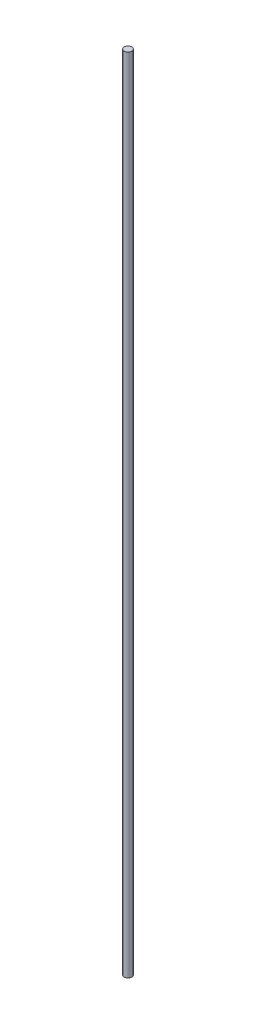
ISO-10303-21;
HEADER;
FILE_DESCRIPTION(('STEP AP214'),'2;1');
FILE_NAME('part.step','',(''),(''),'','','');
FILE_SCHEMA(('AUTOMOTIVE_DESIGN { 1 0 10303 214 1 1 1 1 }'));
ENDSEC;
DATA;
#1=APPLICATION_CONTEXT('core data for automotive mechanical design processes');
#2=APPLICATION_PROTOCOL_DEFINITION('international standard','automotive_design',2000,#1);
#3=PRODUCT_CONTEXT('',#1,'mechanical');
#4=PRODUCT('Part','Part','',(#3));
#5=PRODUCT_RELATED_PRODUCT_CATEGORY('part','',(#4));
#6=PRODUCT_DEFINITION_FORMATION('','',#4);
#7=PRODUCT_DEFINITION_CONTEXT('part definition',#1,'design');
#8=PRODUCT_DEFINITION('design','',#6,#7);
#9=PRODUCT_DEFINITION_SHAPE('','',#8);
#10=(LENGTH_UNIT() NAMED_UNIT(*) SI_UNIT(.MILLI.,.METRE.));
#11=(NAMED_UNIT(*) PLANE_ANGLE_UNIT() SI_UNIT($,.RADIAN.));
#12=(NAMED_UNIT(*) SI_UNIT($,.STERADIAN.) SOLID_ANGLE_UNIT());
#13=UNCERTAINTY_MEASURE_WITH_UNIT(LENGTH_MEASURE(1.E-05),#10,'distance_accuracy_value','');
#14=(GEOMETRIC_REPRESENTATION_CONTEXT(3) GLOBAL_UNCERTAINTY_ASSIGNED_CONTEXT((#13)) GLOBAL_UNIT_ASSIGNED_CONTEXT((#10,
#11,#12)) REPRESENTATION_CONTEXT('',''));
#15=CARTESIAN_POINT('',(0.,0.,0.));
#16=DIRECTION('',(0.,0.,1.));
#17=DIRECTION('',(1.,0.,0.));
#18=AXIS2_PLACEMENT_3D('',#15,#16,#17);
#19=CARTESIAN_POINT('',(0.,340.5,0.));
#20=DIRECTION('',(0.,-1.,0.));
#21=DIRECTION('',(0.,0.,-1.));
#22=AXIS2_PLACEMENT_3D('',#19,#20,#21);
#23=CYLINDRICAL_SURFACE('',#22,1.59);
#24=CARTESIAN_POINT('',(0.,340.5,0.));
#25=DIRECTION('',(0.,1.,0.));
#26=DIRECTION('',(0.,0.,1.));
#27=AXIS2_PLACEMENT_3D('',#24,#25,#26);
#28=CIRCLE('',#27,1.59);
#29=CARTESIAN_POINT('',(0.,340.5,1.59));
#30=VERTEX_POINT('',#29);
#31=EDGE_CURVE('E10',#30,#30,#28,.T.);
#32=ORIENTED_EDGE('',*,*,#31,.F.);
#33=EDGE_LOOP('',(#32));
#34=FACE_BOUND('',#33,.T.);
#35=CARTESIAN_POINT('',(0.,0.,0.));
#36=DIRECTION('',(0.,1.,0.));
#37=DIRECTION('',(0.,0.,1.));
#38=AXIS2_PLACEMENT_3D('',#35,#36,#37);
#39=CIRCLE('',#38,1.59);
#40=CARTESIAN_POINT('',(0.,0.,1.59));
#41=VERTEX_POINT('',#40);
#42=EDGE_CURVE('E34',#41,#41,#39,.T.);
#43=ORIENTED_EDGE('',*,*,#42,.T.);
#44=EDGE_LOOP('',(#43));
#45=FACE_BOUND('',#44,.T.);
#46=ADVANCED_FACE('F31',(#34,#45),#23,.T.);
#47=CARTESIAN_POINT('',(0.,340.5,0.));
#48=DIRECTION('',(0.,1.,0.));
#49=DIRECTION('',(0.,0.,1.));
#50=AXIS2_PLACEMENT_3D('',#47,#48,#49);
#51=PLANE('',#50);
#52=ORIENTED_EDGE('',*,*,#31,.T.);
#53=EDGE_LOOP('',(#52));
#54=FACE_BOUND('',#53,.T.);
#55=ADVANCED_FACE('F46',(#54),#51,.T.);
#56=CARTESIAN_POINT('',(0.,0.,0.));
#57=DIRECTION('',(0.,1.,0.));
#58=DIRECTION('',(0.,0.,1.));
#59=AXIS2_PLACEMENT_3D('',#56,#57,#58);
#60=PLANE('',#59);
#61=ORIENTED_EDGE('',*,*,#42,.F.);
#62=EDGE_LOOP('',(#61));
#63=FACE_BOUND('',#62,.T.);
#64=ADVANCED_FACE('F44',(#63),#60,.F.);
#65=CLOSED_SHELL('',(#46,#55,#64));
#66=MANIFOLD_SOLID_BREP('B2',#65);
#67=ADVANCED_BREP_SHAPE_REPRESENTATION('',(#18,#66),#14);
#68=SHAPE_DEFINITION_REPRESENTATION(#9,#67);
ENDSEC;
END-ISO-10303-21;
